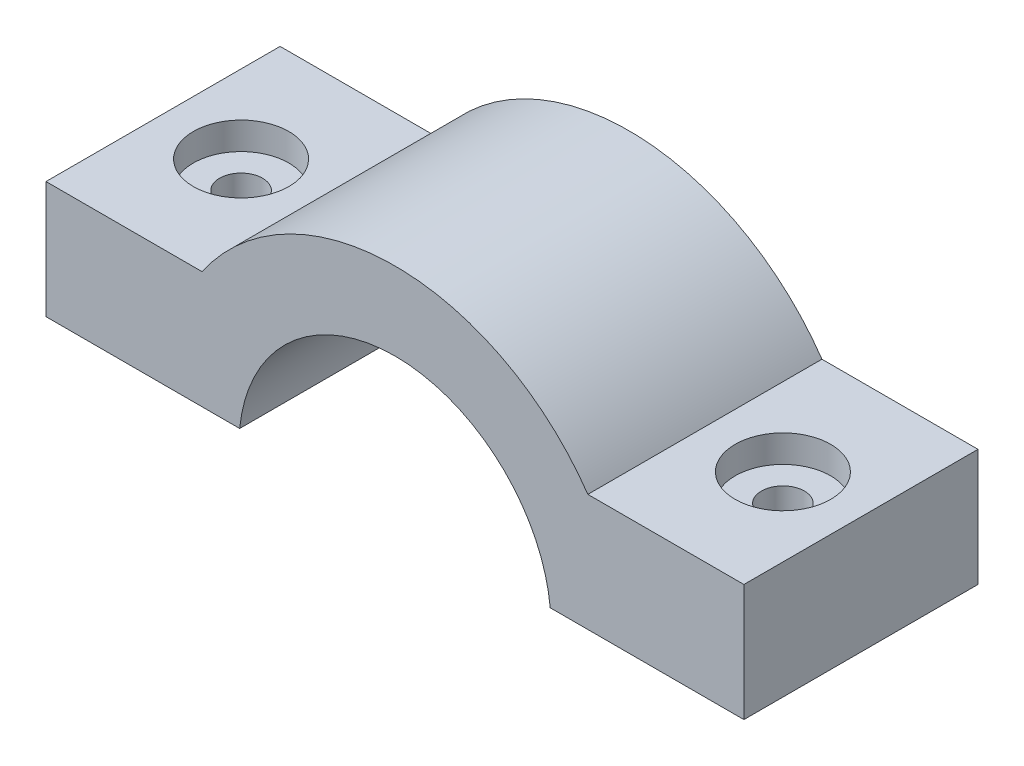
ISO-10303-21;
HEADER;
FILE_DESCRIPTION(('STEP AP214'),'2;1');
FILE_NAME('part.step','',(''),(''),'','','');
FILE_SCHEMA(('AUTOMOTIVE_DESIGN { 1 0 10303 214 1 1 1 1 }'));
ENDSEC;
DATA;
#1=APPLICATION_CONTEXT('core data for automotive mechanical design processes');
#2=APPLICATION_PROTOCOL_DEFINITION('international standard','automotive_design',2000,#1);
#3=PRODUCT_CONTEXT('',#1,'mechanical');
#4=PRODUCT('Part','Part','',(#3));
#5=PRODUCT_RELATED_PRODUCT_CATEGORY('part','',(#4));
#6=PRODUCT_DEFINITION_FORMATION('','',#4);
#7=PRODUCT_DEFINITION_CONTEXT('part definition',#1,'design');
#8=PRODUCT_DEFINITION('design','',#6,#7);
#9=PRODUCT_DEFINITION_SHAPE('','',#8);
#10=(LENGTH_UNIT() NAMED_UNIT(*) SI_UNIT(.MILLI.,.METRE.));
#11=(NAMED_UNIT(*) PLANE_ANGLE_UNIT() SI_UNIT($,.RADIAN.));
#12=(NAMED_UNIT(*) SI_UNIT($,.STERADIAN.) SOLID_ANGLE_UNIT());
#13=UNCERTAINTY_MEASURE_WITH_UNIT(LENGTH_MEASURE(1.E-05),#10,'distance_accuracy_value','');
#14=(GEOMETRIC_REPRESENTATION_CONTEXT(3) GLOBAL_UNCERTAINTY_ASSIGNED_CONTEXT((#13)) GLOBAL_UNIT_ASSIGNED_CONTEXT((#10,
#11,#12)) REPRESENTATION_CONTEXT('',''));
#15=CARTESIAN_POINT('',(0.,0.,0.));
#16=DIRECTION('',(0.,0.,1.));
#17=DIRECTION('',(1.,0.,0.));
#18=AXIS2_PLACEMENT_3D('',#15,#16,#17);
#19=CARTESIAN_POINT('',(42.6646951238373,12.9292003817143,15.));
#20=DIRECTION('',(0.,1.,0.));
#21=DIRECTION('',(0.,0.,1.));
#22=AXIS2_PLACEMENT_3D('',#19,#20,#21);
#23=PLANE('',#22);
#24=CARTESIAN_POINT('',(52.6646951238373,12.9292003817143,0.));
#25=DIRECTION('',(0.,1.,0.));
#26=DIRECTION('',(0.,0.,1.));
#27=AXIS2_PLACEMENT_3D('',#24,#25,#26);
#28=CIRCLE('',#27,6.119);
#29=CARTESIAN_POINT('',(52.6646951238373,12.9292003817143,6.119));
#30=VERTEX_POINT('',#29);
#31=EDGE_CURVE('E239',#30,#30,#28,.T.);
#32=ORIENTED_EDGE('',*,*,#31,.F.);
#33=EDGE_LOOP('',(#32));
#34=FACE_BOUND('',#33,.T.);
#35=DIRECTION('',(1.,0.,0.));
#36=VECTOR('',#35,1.);
#37=CARTESIAN_POINT('',(42.6646951238373,12.9292003817143,-15.));
#38=LINE('',#37,#36);
#39=CARTESIAN_POINT('',(42.6646951238373,12.9292003817143,-15.));
#40=VERTEX_POINT('',#39);
#41=CARTESIAN_POINT('',(62.6646951238373,12.9292003817143,-15.));
#42=VERTEX_POINT('',#41);
#43=EDGE_CURVE('E140',#40,#42,#38,.T.);
#44=ORIENTED_EDGE('',*,*,#43,.F.);
#45=DIRECTION('',(0.,0.,-1.));
#46=VECTOR('',#45,1.);
#47=CARTESIAN_POINT('',(42.6646951238373,12.9292003817143,15.));
#48=LINE('',#47,#46);
#49=CARTESIAN_POINT('',(42.6646951238373,12.9292003817143,15.));
#50=VERTEX_POINT('',#49);
#51=EDGE_CURVE('E13',#50,#40,#48,.T.);
#52=ORIENTED_EDGE('',*,*,#51,.F.);
#53=DIRECTION('',(1.,0.,0.));
#54=VECTOR('',#53,1.);
#55=CARTESIAN_POINT('',(42.6646951238373,12.9292003817143,15.));
#56=LINE('',#55,#54);
#57=CARTESIAN_POINT('',(62.6646951238373,12.9292003817143,15.));
#58=VERTEX_POINT('',#57);
#59=EDGE_CURVE('E159',#50,#58,#56,.T.);
#60=ORIENTED_EDGE('',*,*,#59,.T.);
#61=DIRECTION('',(0.,0.,-1.));
#62=VECTOR('',#61,1.);
#63=CARTESIAN_POINT('',(62.6646951238373,12.9292003817143,15.));
#64=LINE('',#63,#62);
#65=EDGE_CURVE('E47',#58,#42,#64,.T.);
#66=ORIENTED_EDGE('',*,*,#65,.T.);
#67=EDGE_LOOP('',(#44,#52,#60,#66));
#68=FACE_BOUND('',#67,.T.);
#69=ADVANCED_FACE('F44',(#34,#68),#23,.T.);
#70=CARTESIAN_POINT('',(42.6646951238373,-2.07079961828568,15.));
#71=DIRECTION('',(-1.,0.,0.));
#72=DIRECTION('',(0.,0.,1.));
#73=AXIS2_PLACEMENT_3D('',#70,#71,#72);
#74=PLANE('',#73);
#75=DIRECTION('',(0.,1.,0.));
#76=VECTOR('',#75,1.);
#77=CARTESIAN_POINT('',(42.6646951238373,-2.07079961828568,-15.));
#78=LINE('',#77,#76);
#79=CARTESIAN_POINT('',(42.6646951238373,-2.07079961828568,-15.));
#80=VERTEX_POINT('',#79);
#81=EDGE_CURVE('E157',#80,#40,#78,.T.);
#82=ORIENTED_EDGE('',*,*,#81,.F.);
#83=DIRECTION('',(0.,0.,-1.));
#84=VECTOR('',#83,1.);
#85=CARTESIAN_POINT('',(42.6646951238373,-2.07079961828568,15.));
#86=LINE('',#85,#84);
#87=CARTESIAN_POINT('',(42.6646951238373,-2.07079961828568,15.));
#88=VERTEX_POINT('',#87);
#89=EDGE_CURVE('E53',#88,#80,#86,.T.);
#90=ORIENTED_EDGE('',*,*,#89,.F.);
#91=DIRECTION('',(0.,1.,0.));
#92=VECTOR('',#91,1.);
#93=CARTESIAN_POINT('',(42.6646951238373,-2.07079961828568,15.));
#94=LINE('',#93,#92);
#95=EDGE_CURVE('E120',#88,#50,#94,.T.);
#96=ORIENTED_EDGE('',*,*,#95,.T.);
#97=ORIENTED_EDGE('',*,*,#51,.T.);
#98=EDGE_LOOP('',(#82,#90,#96,#97));
#99=FACE_BOUND('',#98,.T.);
#100=ADVANCED_FACE('F174',(#99),#74,.T.);
#101=CARTESIAN_POINT('',(42.6646951238373,-2.07079961828568,15.));
#102=DIRECTION('',(0.,1.,0.));
#103=DIRECTION('',(0.,0.,1.));
#104=AXIS2_PLACEMENT_3D('',#101,#102,#103);
#105=PLANE('',#104);
#106=CARTESIAN_POINT('',(52.6646951238373,-2.07079961828568,0.));
#107=DIRECTION('',(0.,1.,0.));
#108=DIRECTION('',(0.,0.,1.));
#109=AXIS2_PLACEMENT_3D('',#106,#107,#108);
#110=CIRCLE('',#109,2.75);
#111=CARTESIAN_POINT('',(52.6646951238373,-2.07079961828568,2.75));
#112=VERTEX_POINT('',#111);
#113=EDGE_CURVE('E246',#112,#112,#110,.T.);
#114=ORIENTED_EDGE('',*,*,#113,.T.);
#115=EDGE_LOOP('',(#114));
#116=FACE_BOUND('',#115,.T.);
#117=DIRECTION('',(1.,0.,0.));
#118=VECTOR('',#117,1.);
#119=CARTESIAN_POINT('',(42.6646951238373,-2.07079961828568,-15.));
#120=LINE('',#119,#118);
#121=CARTESIAN_POINT('',(67.4833605703214,-2.07079961828568,-15.));
#122=VERTEX_POINT('',#121);
#123=EDGE_CURVE('E125',#80,#122,#120,.T.);
#124=ORIENTED_EDGE('',*,*,#123,.T.);
#125=DIRECTION('',(0.,0.,-1.));
#126=VECTOR('',#125,1.);
#127=CARTESIAN_POINT('',(67.4833605703214,-2.07079961828568,15.));
#128=LINE('',#127,#126);
#129=CARTESIAN_POINT('',(67.4833605703214,-2.07079961828568,15.));
#130=VERTEX_POINT('',#129);
#131=EDGE_CURVE('E123',#130,#122,#128,.T.);
#132=ORIENTED_EDGE('',*,*,#131,.F.);
#133=DIRECTION('',(1.,0.,0.));
#134=VECTOR('',#133,1.);
#135=CARTESIAN_POINT('',(42.6646951238373,-2.07079961828568,15.));
#136=LINE('',#135,#134);
#137=EDGE_CURVE('E114',#88,#130,#136,.T.);
#138=ORIENTED_EDGE('',*,*,#137,.F.);
#139=ORIENTED_EDGE('',*,*,#89,.T.);
#140=EDGE_LOOP('',(#124,#132,#138,#139));
#141=FACE_BOUND('',#140,.T.);
#142=ADVANCED_FACE('F124',(#116,#141),#105,.F.);
#143=CARTESIAN_POINT('',(87.3831093124538,-4.07079961828569,15.));
#144=DIRECTION('',(0.,0.,-1.));
#145=DIRECTION('',(-1.,0.,0.));
#146=AXIS2_PLACEMENT_3D('',#143,#144,#145);
#147=CYLINDRICAL_SURFACE('',#146,20.);
#148=CARTESIAN_POINT('',(87.3831093124538,-4.07079961828569,-15.));
#149=DIRECTION('',(0.,0.,-1.));
#150=DIRECTION('',(-1.,0.,0.));
#151=AXIS2_PLACEMENT_3D('',#148,#149,#150);
#152=CIRCLE('',#151,20.);
#153=CARTESIAN_POINT('',(107.282858054586,-2.07079961828568,-15.));
#154=VERTEX_POINT('',#153);
#155=EDGE_CURVE('E154',#122,#154,#152,.T.);
#156=ORIENTED_EDGE('',*,*,#155,.T.);
#157=DIRECTION('',(0.,0.,-1.));
#158=VECTOR('',#157,1.);
#159=CARTESIAN_POINT('',(107.282858054586,-2.07079961828568,15.));
#160=LINE('',#159,#158);
#161=CARTESIAN_POINT('',(107.282858054586,-2.07079961828568,15.));
#162=VERTEX_POINT('',#161);
#163=EDGE_CURVE('E128',#162,#154,#160,.T.);
#164=ORIENTED_EDGE('',*,*,#163,.F.);
#165=CARTESIAN_POINT('',(87.3831093124538,-4.07079961828569,15.));
#166=DIRECTION('',(0.,0.,-1.));
#167=DIRECTION('',(-1.,0.,0.));
#168=AXIS2_PLACEMENT_3D('',#165,#166,#167);
#169=CIRCLE('',#168,20.);
#170=EDGE_CURVE('E118',#130,#162,#169,.T.);
#171=ORIENTED_EDGE('',*,*,#170,.F.);
#172=ORIENTED_EDGE('',*,*,#131,.T.);
#173=EDGE_LOOP('',(#156,#164,#171,#172));
#174=FACE_BOUND('',#173,.T.);
#175=ADVANCED_FACE('F130',(#174),#147,.F.);
#176=CARTESIAN_POINT('',(107.282858054586,-2.07079961828568,15.));
#177=DIRECTION('',(0.,1.,0.));
#178=DIRECTION('',(0.,0.,1.));
#179=AXIS2_PLACEMENT_3D('',#176,#177,#178);
#180=PLANE('',#179);
#181=CARTESIAN_POINT('',(122.10152350107,-2.07079961828568,0.));
#182=DIRECTION('',(0.,1.,0.));
#183=DIRECTION('',(0.,0.,1.));
#184=AXIS2_PLACEMENT_3D('',#181,#182,#183);
#185=CIRCLE('',#184,2.75);
#186=CARTESIAN_POINT('',(122.10152350107,-2.07079961828568,2.75));
#187=VERTEX_POINT('',#186);
#188=EDGE_CURVE('E144',#187,#187,#185,.T.);
#189=ORIENTED_EDGE('',*,*,#188,.T.);
#190=EDGE_LOOP('',(#189));
#191=FACE_BOUND('',#190,.T.);
#192=DIRECTION('',(1.,0.,0.));
#193=VECTOR('',#192,1.);
#194=CARTESIAN_POINT('',(107.282858054586,-2.07079961828568,-15.));
#195=LINE('',#194,#193);
#196=CARTESIAN_POINT('',(132.10152350107,-2.07079961828568,-15.));
#197=VERTEX_POINT('',#196);
#198=EDGE_CURVE('E152',#154,#197,#195,.T.);
#199=ORIENTED_EDGE('',*,*,#198,.T.);
#200=DIRECTION('',(0.,0.,-1.));
#201=VECTOR('',#200,1.);
#202=CARTESIAN_POINT('',(132.10152350107,-2.07079961828568,15.));
#203=LINE('',#202,#201);
#204=CARTESIAN_POINT('',(132.10152350107,-2.07079961828568,15.));
#205=VERTEX_POINT('',#204);
#206=EDGE_CURVE('E163',#205,#197,#203,.T.);
#207=ORIENTED_EDGE('',*,*,#206,.F.);
#208=DIRECTION('',(1.,0.,0.));
#209=VECTOR('',#208,1.);
#210=CARTESIAN_POINT('',(107.282858054586,-2.07079961828568,15.));
#211=LINE('',#210,#209);
#212=EDGE_CURVE('E133',#162,#205,#211,.T.);
#213=ORIENTED_EDGE('',*,*,#212,.F.);
#214=ORIENTED_EDGE('',*,*,#163,.T.);
#215=EDGE_LOOP('',(#199,#207,#213,#214));
#216=FACE_BOUND('',#215,.T.);
#217=ADVANCED_FACE('F189',(#191,#216),#180,.F.);
#218=CARTESIAN_POINT('',(132.10152350107,-2.07079961828568,15.));
#219=DIRECTION('',(-1.,0.,0.));
#220=DIRECTION('',(0.,0.,1.));
#221=AXIS2_PLACEMENT_3D('',#218,#219,#220);
#222=PLANE('',#221);
#223=DIRECTION('',(0.,1.,0.));
#224=VECTOR('',#223,1.);
#225=CARTESIAN_POINT('',(132.10152350107,-2.07079961828568,-15.));
#226=LINE('',#225,#224);
#227=CARTESIAN_POINT('',(132.10152350107,12.9292003817143,-15.));
#228=VERTEX_POINT('',#227);
#229=EDGE_CURVE('E150',#197,#228,#226,.T.);
#230=ORIENTED_EDGE('',*,*,#229,.T.);
#231=DIRECTION('',(0.,0.,-1.));
#232=VECTOR('',#231,1.);
#233=CARTESIAN_POINT('',(132.10152350107,12.9292003817143,15.));
#234=LINE('',#233,#232);
#235=CARTESIAN_POINT('',(132.10152350107,12.9292003817143,15.));
#236=VERTEX_POINT('',#235);
#237=EDGE_CURVE('E166',#236,#228,#234,.T.);
#238=ORIENTED_EDGE('',*,*,#237,.F.);
#239=DIRECTION('',(0.,1.,0.));
#240=VECTOR('',#239,1.);
#241=CARTESIAN_POINT('',(132.10152350107,-2.07079961828568,15.));
#242=LINE('',#241,#240);
#243=EDGE_CURVE('E135',#205,#236,#242,.T.);
#244=ORIENTED_EDGE('',*,*,#243,.F.);
#245=ORIENTED_EDGE('',*,*,#206,.T.);
#246=EDGE_LOOP('',(#230,#238,#244,#245));
#247=FACE_BOUND('',#246,.T.);
#248=ADVANCED_FACE('F192',(#247),#222,.F.);
#249=CARTESIAN_POINT('',(132.10152350107,12.9292003817143,15.));
#250=DIRECTION('',(0.,-1.,0.));
#251=DIRECTION('',(1.,0.,0.));
#252=AXIS2_PLACEMENT_3D('',#249,#250,#251);
#253=PLANE('',#252);
#254=CARTESIAN_POINT('',(122.10152350107,12.9292003817143,0.));
#255=DIRECTION('',(0.,1.,0.));
#256=DIRECTION('',(0.,0.,1.));
#257=AXIS2_PLACEMENT_3D('',#254,#255,#256);
#258=CIRCLE('',#257,6.11900000000001);
#259=CARTESIAN_POINT('',(122.10152350107,12.9292003817143,6.11900000000001));
#260=VERTEX_POINT('',#259);
#261=EDGE_CURVE('E249',#260,#260,#258,.T.);
#262=ORIENTED_EDGE('',*,*,#261,.F.);
#263=EDGE_LOOP('',(#262));
#264=FACE_BOUND('',#263,.T.);
#265=DIRECTION('',(-1.,0.,0.));
#266=VECTOR('',#265,1.);
#267=CARTESIAN_POINT('',(132.10152350107,12.9292003817143,-15.));
#268=LINE('',#267,#266);
#269=CARTESIAN_POINT('',(112.10152350107,12.9292003817143,-15.));
#270=VERTEX_POINT('',#269);
#271=EDGE_CURVE('E147',#228,#270,#268,.T.);
#272=ORIENTED_EDGE('',*,*,#271,.T.);
#273=DIRECTION('',(0.,0.,-1.));
#274=VECTOR('',#273,1.);
#275=CARTESIAN_POINT('',(112.10152350107,12.9292003817143,15.));
#276=LINE('',#275,#274);
#277=CARTESIAN_POINT('',(112.10152350107,12.9292003817143,15.));
#278=VERTEX_POINT('',#277);
#279=EDGE_CURVE('E168',#278,#270,#276,.T.);
#280=ORIENTED_EDGE('',*,*,#279,.F.);
#281=DIRECTION('',(-1.,0.,0.));
#282=VECTOR('',#281,1.);
#283=CARTESIAN_POINT('',(132.10152350107,12.9292003817143,15.));
#284=LINE('',#283,#282);
#285=EDGE_CURVE('E263',#236,#278,#284,.T.);
#286=ORIENTED_EDGE('',*,*,#285,.F.);
#287=ORIENTED_EDGE('',*,*,#237,.T.);
#288=EDGE_LOOP('',(#272,#280,#286,#287));
#289=FACE_BOUND('',#288,.T.);
#290=ADVANCED_FACE('F196',(#264,#289),#253,.F.);
#291=CARTESIAN_POINT('',(87.3831093124538,-4.07079961828569,15.));
#292=DIRECTION('',(0.,0.,-1.));
#293=DIRECTION('',(-1.,0.,0.));
#294=AXIS2_PLACEMENT_3D('',#291,#292,#293);
#295=CYLINDRICAL_SURFACE('',#294,30.);
#296=CARTESIAN_POINT('',(87.3831093124538,-4.07079961828569,-15.));
#297=DIRECTION('',(0.,0.,-1.));
#298=DIRECTION('',(-1.,0.,0.));
#299=AXIS2_PLACEMENT_3D('',#296,#297,#298);
#300=CIRCLE('',#299,30.);
#301=EDGE_CURVE('E143',#42,#270,#300,.T.);
#302=ORIENTED_EDGE('',*,*,#301,.F.);
#303=ORIENTED_EDGE('',*,*,#65,.F.);
#304=CARTESIAN_POINT('',(87.3831093124538,-4.07079961828569,15.));
#305=DIRECTION('',(0.,0.,-1.));
#306=DIRECTION('',(-1.,0.,0.));
#307=AXIS2_PLACEMENT_3D('',#304,#305,#306);
#308=CIRCLE('',#307,30.);
#309=EDGE_CURVE('E261',#58,#278,#308,.T.);
#310=ORIENTED_EDGE('',*,*,#309,.T.);
#311=ORIENTED_EDGE('',*,*,#279,.T.);
#312=EDGE_LOOP('',(#302,#303,#310,#311));
#313=FACE_BOUND('',#312,.T.);
#314=ADVANCED_FACE('F170',(#313),#295,.T.);
#315=CARTESIAN_POINT('',(87.3831093124538,-4.07079961828569,15.));
#316=DIRECTION('',(0.,0.,-1.));
#317=DIRECTION('',(-1.,0.,0.));
#318=AXIS2_PLACEMENT_3D('',#315,#316,#317);
#319=PLANE('',#318);
#320=ORIENTED_EDGE('',*,*,#59,.F.);
#321=ORIENTED_EDGE('',*,*,#95,.F.);
#322=ORIENTED_EDGE('',*,*,#137,.T.);
#323=ORIENTED_EDGE('',*,*,#170,.T.);
#324=ORIENTED_EDGE('',*,*,#212,.T.);
#325=ORIENTED_EDGE('',*,*,#243,.T.);
#326=ORIENTED_EDGE('',*,*,#285,.T.);
#327=ORIENTED_EDGE('',*,*,#309,.F.);
#328=EDGE_LOOP('',(#320,#321,#322,#323,#324,#325,#326,#327));
#329=FACE_BOUND('',#328,.T.);
#330=ADVANCED_FACE('F116',(#329),#319,.F.);
#331=CARTESIAN_POINT('',(87.3831093124538,-4.07079961828569,-15.));
#332=DIRECTION('',(0.,0.,-1.));
#333=DIRECTION('',(-1.,0.,0.));
#334=AXIS2_PLACEMENT_3D('',#331,#332,#333);
#335=PLANE('',#334);
#336=ORIENTED_EDGE('',*,*,#43,.T.);
#337=ORIENTED_EDGE('',*,*,#301,.T.);
#338=ORIENTED_EDGE('',*,*,#271,.F.);
#339=ORIENTED_EDGE('',*,*,#229,.F.);
#340=ORIENTED_EDGE('',*,*,#198,.F.);
#341=ORIENTED_EDGE('',*,*,#155,.F.);
#342=ORIENTED_EDGE('',*,*,#123,.F.);
#343=ORIENTED_EDGE('',*,*,#81,.T.);
#344=EDGE_LOOP('',(#336,#337,#338,#339,#340,#341,#342,#343));
#345=FACE_BOUND('',#344,.T.);
#346=ADVANCED_FACE('F173',(#345),#335,.T.);
#347=CARTESIAN_POINT('',(122.10152350107,12.9292003817143,0.));
#348=DIRECTION('',(0.,1.,0.));
#349=DIRECTION('',(0.,0.,1.));
#350=AXIS2_PLACEMENT_3D('',#347,#348,#349);
#351=CYLINDRICAL_SURFACE('',#350,2.75);
#352=ORIENTED_EDGE('',*,*,#188,.F.);
#353=EDGE_LOOP('',(#352));
#354=FACE_BOUND('',#353,.T.);
#355=CARTESIAN_POINT('',(122.10152350107,9.42920038171432,0.));
#356=DIRECTION('',(0.,1.,0.));
#357=DIRECTION('',(0.,0.,1.));
#358=AXIS2_PLACEMENT_3D('',#355,#356,#357);
#359=CIRCLE('',#358,2.75);
#360=CARTESIAN_POINT('',(122.10152350107,9.42920038171432,2.75));
#361=VERTEX_POINT('',#360);
#362=EDGE_CURVE('E255',#361,#361,#359,.T.);
#363=ORIENTED_EDGE('',*,*,#362,.T.);
#364=EDGE_LOOP('',(#363));
#365=FACE_BOUND('',#364,.T.);
#366=ADVANCED_FACE('F207',(#354,#365),#351,.F.);
#367=CARTESIAN_POINT('',(124.85152350107,9.42920038171432,0.));
#368=DIRECTION('',(0.,-1.,0.));
#369=DIRECTION('',(0.,0.,-1.));
#370=AXIS2_PLACEMENT_3D('',#367,#368,#369);
#371=PLANE('',#370);
#372=ORIENTED_EDGE('',*,*,#362,.F.);
#373=EDGE_LOOP('',(#372));
#374=FACE_BOUND('',#373,.T.);
#375=CARTESIAN_POINT('',(122.10152350107,9.42920038171432,0.));
#376=DIRECTION('',(0.,1.,0.));
#377=DIRECTION('',(0.,0.,1.));
#378=AXIS2_PLACEMENT_3D('',#375,#376,#377);
#379=CIRCLE('',#378,6.11900000000001);
#380=CARTESIAN_POINT('',(122.10152350107,9.42920038171432,6.11900000000001));
#381=VERTEX_POINT('',#380);
#382=EDGE_CURVE('E252',#381,#381,#379,.T.);
#383=ORIENTED_EDGE('',*,*,#382,.T.);
#384=EDGE_LOOP('',(#383));
#385=FACE_BOUND('',#384,.T.);
#386=ADVANCED_FACE('F211',(#374,#385),#371,.F.);
#387=CARTESIAN_POINT('',(122.10152350107,12.9292003817143,0.));
#388=DIRECTION('',(0.,1.,0.));
#389=DIRECTION('',(0.,0.,1.));
#390=AXIS2_PLACEMENT_3D('',#387,#388,#389);
#391=CYLINDRICAL_SURFACE('',#390,6.11900000000001);
#392=ORIENTED_EDGE('',*,*,#382,.F.);
#393=EDGE_LOOP('',(#392));
#394=FACE_BOUND('',#393,.T.);
#395=ORIENTED_EDGE('',*,*,#261,.T.);
#396=EDGE_LOOP('',(#395));
#397=FACE_BOUND('',#396,.T.);
#398=ADVANCED_FACE('F215',(#394,#397),#391,.F.);
#399=CARTESIAN_POINT('',(52.6646951238373,12.9292003817143,0.));
#400=DIRECTION('',(0.,1.,0.));
#401=DIRECTION('',(0.,0.,1.));
#402=AXIS2_PLACEMENT_3D('',#399,#400,#401);
#403=CYLINDRICAL_SURFACE('',#402,2.75);
#404=ORIENTED_EDGE('',*,*,#113,.F.);
#405=EDGE_LOOP('',(#404));
#406=FACE_BOUND('',#405,.T.);
#407=CARTESIAN_POINT('',(52.6646951238373,9.42920038171432,0.));
#408=DIRECTION('',(0.,1.,0.));
#409=DIRECTION('',(0.,0.,1.));
#410=AXIS2_PLACEMENT_3D('',#407,#408,#409);
#411=CIRCLE('',#410,2.75);
#412=CARTESIAN_POINT('',(52.6646951238373,9.42920038171432,2.75));
#413=VERTEX_POINT('',#412);
#414=EDGE_CURVE('E241',#413,#413,#411,.T.);
#415=ORIENTED_EDGE('',*,*,#414,.T.);
#416=EDGE_LOOP('',(#415));
#417=FACE_BOUND('',#416,.T.);
#418=ADVANCED_FACE('F219',(#406,#417),#403,.F.);
#419=CARTESIAN_POINT('',(55.4146951238373,9.42920038171432,0.));
#420=DIRECTION('',(0.,-1.,0.));
#421=DIRECTION('',(0.,0.,-1.));
#422=AXIS2_PLACEMENT_3D('',#419,#420,#421);
#423=PLANE('',#422);
#424=ORIENTED_EDGE('',*,*,#414,.F.);
#425=EDGE_LOOP('',(#424));
#426=FACE_BOUND('',#425,.T.);
#427=CARTESIAN_POINT('',(52.6646951238373,9.42920038171432,0.));
#428=DIRECTION('',(0.,1.,0.));
#429=DIRECTION('',(0.,0.,1.));
#430=AXIS2_PLACEMENT_3D('',#427,#428,#429);
#431=CIRCLE('',#430,6.119);
#432=CARTESIAN_POINT('',(52.6646951238373,9.42920038171432,6.119));
#433=VERTEX_POINT('',#432);
#434=EDGE_CURVE('E236',#433,#433,#431,.T.);
#435=ORIENTED_EDGE('',*,*,#434,.T.);
#436=EDGE_LOOP('',(#435));
#437=FACE_BOUND('',#436,.T.);
#438=ADVANCED_FACE('F223',(#426,#437),#423,.F.);
#439=CARTESIAN_POINT('',(52.6646951238373,12.9292003817143,0.));
#440=DIRECTION('',(0.,1.,0.));
#441=DIRECTION('',(0.,0.,1.));
#442=AXIS2_PLACEMENT_3D('',#439,#440,#441);
#443=CYLINDRICAL_SURFACE('',#442,6.119);
#444=ORIENTED_EDGE('',*,*,#434,.F.);
#445=EDGE_LOOP('',(#444));
#446=FACE_BOUND('',#445,.T.);
#447=ORIENTED_EDGE('',*,*,#31,.T.);
#448=EDGE_LOOP('',(#447));
#449=FACE_BOUND('',#448,.T.);
#450=ADVANCED_FACE('F227',(#446,#449),#443,.F.);
#451=CLOSED_SHELL('',(#69,#100,#142,#175,#217,#248,#290,#314,#330,#346,#366,#386,#398,#418,#438,#450));
#452=MANIFOLD_SOLID_BREP('B2',#451);
#453=ADVANCED_BREP_SHAPE_REPRESENTATION('',(#18,#452),#14);
#454=SHAPE_DEFINITION_REPRESENTATION(#9,#453);
ENDSEC;
END-ISO-10303-21;
